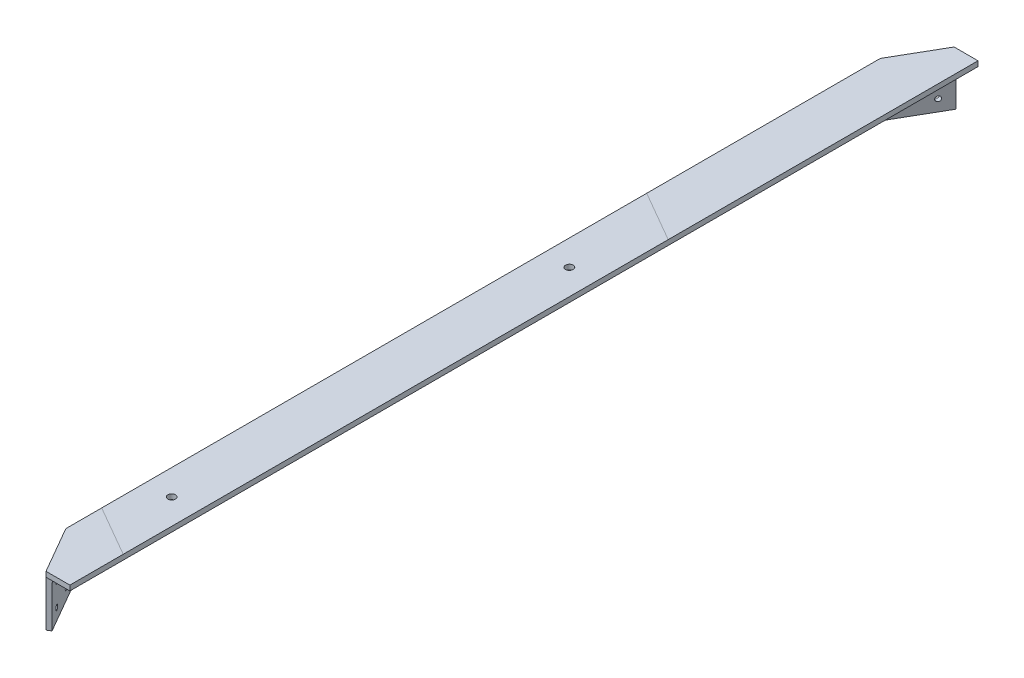
ISO-10303-21;
HEADER;
FILE_DESCRIPTION(('STEP AP214'),'2;1');
FILE_NAME('part.step','',(''),(''),'','','');
FILE_SCHEMA(('AUTOMOTIVE_DESIGN { 1 0 10303 214 1 1 1 1 }'));
ENDSEC;
DATA;
#1=APPLICATION_CONTEXT('core data for automotive mechanical design processes');
#2=APPLICATION_PROTOCOL_DEFINITION('international standard','automotive_design',2000,#1);
#3=PRODUCT_CONTEXT('',#1,'mechanical');
#4=PRODUCT('Part','Part','',(#3));
#5=PRODUCT_RELATED_PRODUCT_CATEGORY('part','',(#4));
#6=PRODUCT_DEFINITION_FORMATION('','',#4);
#7=PRODUCT_DEFINITION_CONTEXT('part definition',#1,'design');
#8=PRODUCT_DEFINITION('design','',#6,#7);
#9=PRODUCT_DEFINITION_SHAPE('','',#8);
#10=(LENGTH_UNIT() NAMED_UNIT(*) SI_UNIT(.MILLI.,.METRE.));
#11=(NAMED_UNIT(*) PLANE_ANGLE_UNIT() SI_UNIT($,.RADIAN.));
#12=(NAMED_UNIT(*) SI_UNIT($,.STERADIAN.) SOLID_ANGLE_UNIT());
#13=UNCERTAINTY_MEASURE_WITH_UNIT(LENGTH_MEASURE(1.E-05),#10,'distance_accuracy_value','');
#14=(GEOMETRIC_REPRESENTATION_CONTEXT(3) GLOBAL_UNCERTAINTY_ASSIGNED_CONTEXT((#13)) GLOBAL_UNIT_ASSIGNED_CONTEXT((#10,
#11,#12)) REPRESENTATION_CONTEXT('',''));
#15=CARTESIAN_POINT('',(0.,0.,0.));
#16=DIRECTION('',(0.,0.,1.));
#17=DIRECTION('',(1.,0.,0.));
#18=AXIS2_PLACEMENT_3D('',#15,#16,#17);
#19=CARTESIAN_POINT('',(-7.99999999999999,8.00000000000001,640.));
#20=DIRECTION('',(0.,-1.,0.));
#21=DIRECTION('',(1.,0.,0.));
#22=AXIS2_PLACEMENT_3D('',#19,#20,#21);
#23=PLANE('',#22);
#24=DIRECTION('',(-0.866025403784436,0.,-0.500000000000005));
#25=VECTOR('',#24,1.);
#26=CARTESIAN_POINT('',(387.319024505817,8.00000000000002,-44.7126356426317));
#27=LINE('',#26,#25);
#28=CARTESIAN_POINT('',(72.,8.00000000000001,-226.762159321677));
#29=VERTEX_POINT('',#28);
#30=CARTESIAN_POINT('',(-7.99999999999999,8.00000000000001,-272.950180856848));
#31=VERTEX_POINT('',#30);
#32=EDGE_CURVE('E11',#29,#31,#27,.T.);
#33=ORIENTED_EDGE('',*,*,#32,.F.);
#34=DIRECTION('',(0.,0.,-1.));
#35=VECTOR('',#34,1.);
#36=CARTESIAN_POINT('',(72.,8.00000000000001,640.));
#37=LINE('',#36,#35);
#38=CARTESIAN_POINT('',(72.,8.,-713.612159321677));
#39=VERTEX_POINT('',#38);
#40=EDGE_CURVE('E295',#29,#39,#37,.T.);
#41=ORIENTED_EDGE('',*,*,#40,.T.);
#42=DIRECTION('',(1.,0.,0.));
#43=VECTOR('',#42,1.);
#44=CARTESIAN_POINT('',(34.4999999999996,8.,-713.612159321677));
#45=LINE('',#44,#43);
#46=CARTESIAN_POINT('',(34.4999999999996,8.,-713.612159321677));
#47=VERTEX_POINT('',#46);
#48=EDGE_CURVE('E225',#47,#39,#45,.T.);
#49=ORIENTED_EDGE('',*,*,#48,.F.);
#50=DIRECTION('',(0.499999999999995,0.,-0.866025403784441));
#51=VECTOR('',#50,1.);
#52=CARTESIAN_POINT('',(-7.99999999999999,8.,-640.));
#53=LINE('',#52,#51);
#54=CARTESIAN_POINT('',(-6.66025403784448,8.,-642.320508075689));
#55=VERTEX_POINT('',#54);
#56=EDGE_CURVE('E228',#55,#47,#53,.T.);
#57=ORIENTED_EDGE('',*,*,#56,.F.);
#58=CARTESIAN_POINT('',(2.00000000000001,8.00000000000001,-637.320508075689));
#59=DIRECTION('',(0.,-1.,0.));
#60=DIRECTION('',(1.,0.,0.));
#61=AXIS2_PLACEMENT_3D('',#58,#59,#60);
#62=CIRCLE('',#61,10.);
#63=CARTESIAN_POINT('',(-7.99999999999999,8.00000000000001,-637.320508075689));
#64=VERTEX_POINT('',#63);
#65=EDGE_CURVE('E352',#55,#64,#62,.F.);
#66=ORIENTED_EDGE('',*,*,#65,.T.);
#67=DIRECTION('',(0.,0.,-1.));
#68=VECTOR('',#67,1.);
#69=CARTESIAN_POINT('',(-7.99999999999999,8.00000000000001,640.));
#70=LINE('',#69,#68);
#71=EDGE_CURVE('E291',#31,#64,#70,.T.);
#72=ORIENTED_EDGE('',*,*,#71,.F.);
#73=EDGE_LOOP('',(#33,#41,#49,#57,#66,#72));
#74=FACE_BOUND('',#73,.T.);
#75=ADVANCED_FACE('F49',(#74),#23,.F.);
#76=DIRECTION('',(0.866025403784436,0.,0.500000000000005));
#77=VECTOR('',#76,1.);
#78=CARTESIAN_POINT('',(16.4331150536629,8.00000000000001,597.68060333988));
#79=LINE('',#78,#77);
#80=CARTESIAN_POINT('',(-8.00000000000001,8.00000000000001,583.574137786507));
#81=VERTEX_POINT('',#80);
#82=CARTESIAN_POINT('',(72.,8.00000000000001,629.762159321678));
#83=VERTEX_POINT('',#82);
#84=EDGE_CURVE('E58',#81,#83,#79,.T.);
#85=ORIENTED_EDGE('',*,*,#84,.F.);
#86=CARTESIAN_POINT('',(-7.99999999999999,8.00000000000001,637.320508075689));
#87=VERTEX_POINT('',#86);
#88=EDGE_CURVE('E292',#87,#81,#70,.T.);
#89=ORIENTED_EDGE('',*,*,#88,.F.);
#90=CARTESIAN_POINT('',(2.00000000000001,8.00000000000001,637.320508075689));
#91=DIRECTION('',(0.,-1.,0.));
#92=DIRECTION('',(1.,0.,0.));
#93=AXIS2_PLACEMENT_3D('',#90,#91,#92);
#94=CIRCLE('',#93,10.);
#95=CARTESIAN_POINT('',(-6.66025403784442,8.,642.320508075689));
#96=VERTEX_POINT('',#95);
#97=EDGE_CURVE('E315',#87,#96,#94,.F.);
#98=ORIENTED_EDGE('',*,*,#97,.T.);
#99=DIRECTION('',(0.499999999999995,0.,0.866025403784441));
#100=VECTOR('',#99,1.);
#101=CARTESIAN_POINT('',(-7.99999999999999,8.,640.));
#102=LINE('',#101,#100);
#103=CARTESIAN_POINT('',(34.4999999999996,8.,713.612159321677));
#104=VERTEX_POINT('',#103);
#105=EDGE_CURVE('E278',#96,#104,#102,.T.);
#106=ORIENTED_EDGE('',*,*,#105,.T.);
#107=DIRECTION('',(1.,0.,0.));
#108=VECTOR('',#107,1.);
#109=CARTESIAN_POINT('',(34.4999999999996,8.,713.612159321677));
#110=LINE('',#109,#108);
#111=CARTESIAN_POINT('',(72.,8.,713.612159321677));
#112=VERTEX_POINT('',#111);
#113=EDGE_CURVE('E280',#104,#112,#110,.T.);
#114=ORIENTED_EDGE('',*,*,#113,.T.);
#115=EDGE_CURVE('E297',#112,#83,#37,.T.);
#116=ORIENTED_EDGE('',*,*,#115,.T.);
#117=EDGE_LOOP('',(#85,#89,#98,#106,#114,#116));
#118=FACE_BOUND('',#117,.T.);
#119=ADVANCED_FACE('F438',(#118),#23,.F.);
#120=CARTESIAN_POINT('',(72.,0.,640.));
#121=DIRECTION('',(0.,1.,0.));
#122=DIRECTION('',(-1.,0.,0.));
#123=AXIS2_PLACEMENT_3D('',#120,#121,#122);
#124=PLANE('',#123);
#125=CARTESIAN_POINT('',(32.,0.,-111.387840678322));
#126=DIRECTION('',(0.,1.,0.));
#127=DIRECTION('',(-1.,0.,0.));
#128=AXIS2_PLACEMENT_3D('',#125,#126,#127);
#129=CIRCLE('',#128,6.00000000000001);
#130=CARTESIAN_POINT('',(26.,0.,-111.387840678322));
#131=VERTEX_POINT('',#130);
#132=EDGE_CURVE('E382',#131,#131,#129,.T.);
#133=ORIENTED_EDGE('',*,*,#132,.T.);
#134=EDGE_LOOP('',(#133));
#135=FACE_BOUND('',#134,.T.);
#136=CARTESIAN_POINT('',(32.,0.,513.612159321678));
#137=DIRECTION('',(0.,1.,0.));
#138=DIRECTION('',(-1.,0.,0.));
#139=AXIS2_PLACEMENT_3D('',#136,#137,#138);
#140=CIRCLE('',#139,6.00000000000001);
#141=CARTESIAN_POINT('',(26.,0.,513.612159321678));
#142=VERTEX_POINT('',#141);
#143=EDGE_CURVE('E604',#142,#142,#140,.T.);
#144=ORIENTED_EDGE('',*,*,#143,.T.);
#145=EDGE_LOOP('',(#144));
#146=FACE_BOUND('',#145,.T.);
#147=DIRECTION('',(0.,0.,-1.));
#148=VECTOR('',#147,1.);
#149=CARTESIAN_POINT('',(8.00000000000001,0.,0.));
#150=LINE('',#149,#148);
#151=CARTESIAN_POINT('',(8.,0.,637.320508075689));
#152=VERTEX_POINT('',#151);
#153=CARTESIAN_POINT('',(8.00000000000001,0.,0.));
#154=VERTEX_POINT('',#153);
#155=EDGE_CURVE('E328',#152,#154,#150,.T.);
#156=ORIENTED_EDGE('',*,*,#155,.T.);
#157=DIRECTION('',(0.,0.,1.));
#158=VECTOR('',#157,1.);
#159=CARTESIAN_POINT('',(8.,0.,-637.320508075689));
#160=LINE('',#159,#158);
#161=CARTESIAN_POINT('',(8.,0.,-637.320508075689));
#162=VERTEX_POINT('',#161);
#163=EDGE_CURVE('E370',#154,#162,#160,.F.);
#164=ORIENTED_EDGE('',*,*,#163,.T.);
#165=CARTESIAN_POINT('',(10.,0.,-637.320508075689));
#166=DIRECTION('',(0.,1.,0.));
#167=DIRECTION('',(-1.,0.,0.));
#168=AXIS2_PLACEMENT_3D('',#165,#166,#167);
#169=CIRCLE('',#168,2.);
#170=CARTESIAN_POINT('',(8.26794919243096,0.,-638.320508075689));
#171=VERTEX_POINT('',#170);
#172=EDGE_CURVE('E368',#162,#171,#169,.F.);
#173=ORIENTED_EDGE('',*,*,#172,.T.);
#174=DIRECTION('',(0.499999999999996,0.,-0.866025403784441));
#175=VECTOR('',#174,1.);
#176=CARTESIAN_POINT('',(-529.328055191762,0.,292.823085463766));
#177=LINE('',#176,#175);
#178=CARTESIAN_POINT('',(47.4282032302751,0.,-706.14805770654));
#179=VERTEX_POINT('',#178);
#180=EDGE_CURVE('E365',#171,#179,#177,.T.);
#181=ORIENTED_EDGE('',*,*,#180,.T.);
#182=DIRECTION('',(-0.866025403784439,0.,-0.5));
#183=VECTOR('',#182,1.);
#184=CARTESIAN_POINT('',(34.4999999999996,0.,-713.612159321677));
#185=LINE('',#184,#183);
#186=CARTESIAN_POINT('',(34.4999999999996,0.,-713.612159321677));
#187=VERTEX_POINT('',#186);
#188=EDGE_CURVE('E212',#179,#187,#185,.T.);
#189=ORIENTED_EDGE('',*,*,#188,.T.);
#190=DIRECTION('',(1.,0.,0.));
#191=VECTOR('',#190,1.);
#192=CARTESIAN_POINT('',(34.4999999999996,0.,-713.612159321677));
#193=LINE('',#192,#191);
#194=CARTESIAN_POINT('',(72.,0.,-713.612159321677));
#195=VERTEX_POINT('',#194);
#196=EDGE_CURVE('E202',#187,#195,#193,.T.);
#197=ORIENTED_EDGE('',*,*,#196,.T.);
#198=DIRECTION('',(0.,0.,-1.));
#199=VECTOR('',#198,1.);
#200=CARTESIAN_POINT('',(72.,0.,640.));
#201=LINE('',#200,#199);
#202=CARTESIAN_POINT('',(72.,0.,713.612159321677));
#203=VERTEX_POINT('',#202);
#204=EDGE_CURVE('E300',#203,#195,#201,.T.);
#205=ORIENTED_EDGE('',*,*,#204,.F.);
#206=DIRECTION('',(1.,0.,0.));
#207=VECTOR('',#206,1.);
#208=CARTESIAN_POINT('',(34.4999999999996,0.,713.612159321677));
#209=LINE('',#208,#207);
#210=CARTESIAN_POINT('',(34.4999999999996,0.,713.612159321677));
#211=VERTEX_POINT('',#210);
#212=EDGE_CURVE('E277',#211,#203,#209,.T.);
#213=ORIENTED_EDGE('',*,*,#212,.F.);
#214=DIRECTION('',(-0.866025403784439,0.,0.5));
#215=VECTOR('',#214,1.);
#216=CARTESIAN_POINT('',(34.4999999999996,0.,713.612159321677));
#217=LINE('',#216,#215);
#218=CARTESIAN_POINT('',(47.4282032302752,0.,706.14805770654));
#219=VERTEX_POINT('',#218);
#220=EDGE_CURVE('E262',#219,#211,#217,.T.);
#221=ORIENTED_EDGE('',*,*,#220,.F.);
#222=DIRECTION('',(0.499999999999996,0.,0.866025403784441));
#223=VECTOR('',#222,1.);
#224=CARTESIAN_POINT('',(8.26794919243111,0.,638.320508075689));
#225=LINE('',#224,#223);
#226=CARTESIAN_POINT('',(8.26794919243111,0.,638.320508075689));
#227=VERTEX_POINT('',#226);
#228=EDGE_CURVE('E324',#219,#227,#225,.F.);
#229=ORIENTED_EDGE('',*,*,#228,.T.);
#230=CARTESIAN_POINT('',(10.,0.,637.320508075689));
#231=DIRECTION('',(0.,1.,0.));
#232=DIRECTION('',(-1.,0.,0.));
#233=AXIS2_PLACEMENT_3D('',#230,#231,#232);
#234=CIRCLE('',#233,2.);
#235=EDGE_CURVE('E326',#227,#152,#234,.F.);
#236=ORIENTED_EDGE('',*,*,#235,.T.);
#237=EDGE_LOOP('',(#156,#164,#173,#181,#189,#197,#205,#213,#221,#229,#236));
#238=FACE_BOUND('',#237,.T.);
#239=ADVANCED_FACE('F445',(#135,#146,#238),#124,.F.);
#240=CARTESIAN_POINT('',(-8.,-72.,640.));
#241=DIRECTION('',(1.,0.,0.));
#242=DIRECTION('',(0.,1.,0.));
#243=AXIS2_PLACEMENT_3D('',#240,#241,#242);
#244=PLANE('',#243);
#245=ORIENTED_EDGE('',*,*,#88,.T.);
#246=EDGE_CURVE('E296',#81,#31,#70,.T.);
#247=ORIENTED_EDGE('',*,*,#246,.T.);
#248=ORIENTED_EDGE('',*,*,#71,.T.);
#249=DIRECTION('',(0.,-1.,0.));
#250=VECTOR('',#249,1.);
#251=CARTESIAN_POINT('',(-8.,-72.,-637.320508075689));
#252=LINE('',#251,#250);
#253=CARTESIAN_POINT('',(-8.,-72.,-637.320508075689));
#254=VERTEX_POINT('',#253);
#255=EDGE_CURVE('E342',#64,#254,#252,.T.);
#256=ORIENTED_EDGE('',*,*,#255,.T.);
#257=DIRECTION('',(0.,0.,-1.));
#258=VECTOR('',#257,1.);
#259=CARTESIAN_POINT('',(-8.,-72.,640.));
#260=LINE('',#259,#258);
#261=CARTESIAN_POINT('',(-8.,-72.,637.320508075689));
#262=VERTEX_POINT('',#261);
#263=EDGE_CURVE('E306',#262,#254,#260,.T.);
#264=ORIENTED_EDGE('',*,*,#263,.F.);
#265=DIRECTION('',(0.,-1.,0.));
#266=VECTOR('',#265,1.);
#267=CARTESIAN_POINT('',(-8.,-72.,637.320508075689));
#268=LINE('',#267,#266);
#269=EDGE_CURVE('E313',#262,#87,#268,.F.);
#270=ORIENTED_EDGE('',*,*,#269,.T.);
#271=EDGE_LOOP('',(#245,#247,#248,#256,#264,#270));
#272=FACE_BOUND('',#271,.T.);
#273=ADVANCED_FACE('F531',(#272),#244,.F.);
#274=CARTESIAN_POINT('',(0.,-72.,640.));
#275=DIRECTION('',(0.,1.,0.));
#276=DIRECTION('',(0.,0.,1.));
#277=AXIS2_PLACEMENT_3D('',#274,#275,#276);
#278=PLANE('',#277);
#279=ORIENTED_EDGE('',*,*,#263,.T.);
#280=CARTESIAN_POINT('',(2.,-72.,-637.320508075689));
#281=DIRECTION('',(0.,1.,0.));
#282=DIRECTION('',(0.,0.,1.));
#283=AXIS2_PLACEMENT_3D('',#280,#281,#282);
#284=CIRCLE('',#283,10.);
#285=CARTESIAN_POINT('',(-6.66025403784449,-72.,-642.320508075689));
#286=VERTEX_POINT('',#285);
#287=EDGE_CURVE('E211',#254,#286,#284,.F.);
#288=ORIENTED_EDGE('',*,*,#287,.T.);
#289=DIRECTION('',(-0.499999999999996,0.,0.866025403784441));
#290=VECTOR('',#289,1.);
#291=CARTESIAN_POINT('',(-8.,-72.,-640.));
#292=LINE('',#291,#290);
#293=CARTESIAN_POINT('',(34.4999999999996,-72.,-713.612159321677));
#294=VERTEX_POINT('',#293);
#295=EDGE_CURVE('E195',#294,#286,#292,.T.);
#296=ORIENTED_EDGE('',*,*,#295,.F.);
#297=DIRECTION('',(-0.866025403784439,0.,-0.5));
#298=VECTOR('',#297,1.);
#299=CARTESIAN_POINT('',(34.4999999999996,-72.,-713.612159321677));
#300=LINE('',#299,#298);
#301=CARTESIAN_POINT('',(40.4999999999997,-72.,-710.14805770654));
#302=VERTEX_POINT('',#301);
#303=EDGE_CURVE('E210',#302,#294,#300,.T.);
#304=ORIENTED_EDGE('',*,*,#303,.F.);
#305=DIRECTION('',(0.499999999999996,0.,-0.866025403784441));
#306=VECTOR('',#305,1.);
#307=CARTESIAN_POINT('',(40.4999999999997,-72.,-710.14805770654));
#308=LINE('',#307,#306);
#309=CARTESIAN_POINT('',(1.33974596215551,-72.,-642.320508075689));
#310=VERTEX_POINT('',#309);
#311=EDGE_CURVE('E217',#310,#302,#308,.T.);
#312=ORIENTED_EDGE('',*,*,#311,.F.);
#313=CARTESIAN_POINT('',(10.,-72.,-637.320508075689));
#314=DIRECTION('',(0.,1.,0.));
#315=DIRECTION('',(0.,0.,1.));
#316=AXIS2_PLACEMENT_3D('',#313,#314,#315);
#317=CIRCLE('',#316,10.);
#318=CARTESIAN_POINT('',(0.,-72.,-637.320508075689));
#319=VERTEX_POINT('',#318);
#320=EDGE_CURVE('E360',#310,#319,#317,.T.);
#321=ORIENTED_EDGE('',*,*,#320,.T.);
#322=DIRECTION('',(0.,0.,-1.));
#323=VECTOR('',#322,1.);
#324=CARTESIAN_POINT('',(0.,-72.,640.));
#325=LINE('',#324,#323);
#326=CARTESIAN_POINT('',(0.,-72.,637.320508075689));
#327=VERTEX_POINT('',#326);
#328=EDGE_CURVE('E303',#327,#319,#325,.T.);
#329=ORIENTED_EDGE('',*,*,#328,.F.);
#330=CARTESIAN_POINT('',(10.,-72.,637.320508075689));
#331=DIRECTION('',(0.,1.,0.));
#332=DIRECTION('',(0.,0.,1.));
#333=AXIS2_PLACEMENT_3D('',#330,#331,#332);
#334=CIRCLE('',#333,10.);
#335=CARTESIAN_POINT('',(1.33974596215557,-72.,642.320508075689));
#336=VERTEX_POINT('',#335);
#337=EDGE_CURVE('E322',#327,#336,#334,.T.);
#338=ORIENTED_EDGE('',*,*,#337,.T.);
#339=DIRECTION('',(0.499999999999996,0.,0.866025403784441));
#340=VECTOR('',#339,1.);
#341=CARTESIAN_POINT('',(40.4999999999997,-72.,710.14805770654));
#342=LINE('',#341,#340);
#343=CARTESIAN_POINT('',(40.4999999999997,-72.,710.14805770654));
#344=VERTEX_POINT('',#343);
#345=EDGE_CURVE('E263',#336,#344,#342,.T.);
#346=ORIENTED_EDGE('',*,*,#345,.T.);
#347=DIRECTION('',(-0.866025403784439,0.,0.5));
#348=VECTOR('',#347,1.);
#349=CARTESIAN_POINT('',(34.4999999999996,-72.,713.612159321677));
#350=LINE('',#349,#348);
#351=CARTESIAN_POINT('',(34.4999999999996,-72.,713.612159321677));
#352=VERTEX_POINT('',#351);
#353=EDGE_CURVE('E265',#344,#352,#350,.T.);
#354=ORIENTED_EDGE('',*,*,#353,.T.);
#355=DIRECTION('',(-0.499999999999996,0.,-0.866025403784441));
#356=VECTOR('',#355,1.);
#357=CARTESIAN_POINT('',(-8.,-72.,640.));
#358=LINE('',#357,#356);
#359=CARTESIAN_POINT('',(-6.66025403784442,-72.,642.320508075689));
#360=VERTEX_POINT('',#359);
#361=EDGE_CURVE('E267',#352,#360,#358,.T.);
#362=ORIENTED_EDGE('',*,*,#361,.T.);
#363=CARTESIAN_POINT('',(2.,-72.,637.320508075689));
#364=DIRECTION('',(0.,1.,0.));
#365=DIRECTION('',(0.,0.,1.));
#366=AXIS2_PLACEMENT_3D('',#363,#364,#365);
#367=CIRCLE('',#366,10.);
#368=EDGE_CURVE('E311',#360,#262,#367,.F.);
#369=ORIENTED_EDGE('',*,*,#368,.T.);
#370=EDGE_LOOP('',(#279,#288,#296,#304,#312,#321,#329,#338,#346,#354,#362,#369));
#371=FACE_BOUND('',#370,.T.);
#372=ADVANCED_FACE('F208',(#371),#278,.F.);
#373=CARTESIAN_POINT('',(0.,0.,640.));
#374=DIRECTION('',(-1.,0.,0.));
#375=DIRECTION('',(0.,-1.,0.));
#376=AXIS2_PLACEMENT_3D('',#373,#374,#375);
#377=PLANE('',#376);
#378=DIRECTION('',(0.,1.,0.));
#379=VECTOR('',#378,1.);
#380=CARTESIAN_POINT('',(0.,0.,-637.320508075689));
#381=LINE('',#380,#379);
#382=CARTESIAN_POINT('',(0.,-8.,-637.320508075689));
#383=VERTEX_POINT('',#382);
#384=EDGE_CURVE('E355',#319,#383,#381,.T.);
#385=ORIENTED_EDGE('',*,*,#384,.T.);
#386=DIRECTION('',(0.,0.,1.));
#387=VECTOR('',#386,1.);
#388=CARTESIAN_POINT('',(0.,-8.,0.));
#389=LINE('',#388,#387);
#390=CARTESIAN_POINT('',(0.,-8.,0.));
#391=VERTEX_POINT('',#390);
#392=EDGE_CURVE('E362',#383,#391,#389,.T.);
#393=ORIENTED_EDGE('',*,*,#392,.T.);
#394=DIRECTION('',(0.,0.,-1.));
#395=VECTOR('',#394,1.);
#396=CARTESIAN_POINT('',(0.,-8.,637.320508075689));
#397=LINE('',#396,#395);
#398=CARTESIAN_POINT('',(0.,-8.00000000000001,637.320508075689));
#399=VERTEX_POINT('',#398);
#400=EDGE_CURVE('E331',#391,#399,#397,.F.);
#401=ORIENTED_EDGE('',*,*,#400,.T.);
#402=DIRECTION('',(0.,1.,0.));
#403=VECTOR('',#402,1.);
#404=CARTESIAN_POINT('',(0.,-72.,637.320508075689));
#405=LINE('',#404,#403);
#406=EDGE_CURVE('E320',#399,#327,#405,.F.);
#407=ORIENTED_EDGE('',*,*,#406,.T.);
#408=ORIENTED_EDGE('',*,*,#328,.T.);
#409=EDGE_LOOP('',(#385,#393,#401,#407,#408));
#410=FACE_BOUND('',#409,.T.);
#411=ADVANCED_FACE('F461',(#410),#377,.F.);
#412=CARTESIAN_POINT('',(72.,8.00000000000001,640.));
#413=DIRECTION('',(-1.,0.,0.));
#414=DIRECTION('',(0.,0.,1.));
#415=AXIS2_PLACEMENT_3D('',#412,#413,#414);
#416=PLANE('',#415);
#417=ORIENTED_EDGE('',*,*,#204,.T.);
#418=DIRECTION('',(0.,-1.,0.));
#419=VECTOR('',#418,1.);
#420=CARTESIAN_POINT('',(72.,8.,-713.612159321677));
#421=LINE('',#420,#419);
#422=EDGE_CURVE('E233',#39,#195,#421,.T.);
#423=ORIENTED_EDGE('',*,*,#422,.F.);
#424=ORIENTED_EDGE('',*,*,#40,.F.);
#425=EDGE_CURVE('E301',#83,#29,#37,.T.);
#426=ORIENTED_EDGE('',*,*,#425,.F.);
#427=ORIENTED_EDGE('',*,*,#115,.F.);
#428=DIRECTION('',(0.,-1.,0.));
#429=VECTOR('',#428,1.);
#430=CARTESIAN_POINT('',(72.,8.,713.612159321677));
#431=LINE('',#430,#429);
#432=EDGE_CURVE('E283',#112,#203,#431,.T.);
#433=ORIENTED_EDGE('',*,*,#432,.T.);
#434=EDGE_LOOP('',(#417,#423,#424,#426,#427,#433));
#435=FACE_BOUND('',#434,.T.);
#436=ADVANCED_FACE('F451',(#435),#416,.F.);
#437=CARTESIAN_POINT('',(32.,8.00000000000001,-111.387840678322));
#438=DIRECTION('',(0.,1.,0.));
#439=DIRECTION('',(-1.,0.,0.));
#440=AXIS2_PLACEMENT_3D('',#437,#438,#439);
#441=CIRCLE('',#440,6.00000000000001);
#442=CARTESIAN_POINT('',(26.,8.00000000000001,-111.387840678322));
#443=VERTEX_POINT('',#442);
#444=EDGE_CURVE('E466',#443,#443,#441,.T.);
#445=ORIENTED_EDGE('',*,*,#444,.F.);
#446=EDGE_LOOP('',(#445));
#447=FACE_BOUND('',#446,.T.);
#448=CARTESIAN_POINT('',(32.,8.00000000000001,513.612159321678));
#449=DIRECTION('',(0.,1.,0.));
#450=DIRECTION('',(-1.,0.,0.));
#451=AXIS2_PLACEMENT_3D('',#448,#449,#450);
#452=CIRCLE('',#451,6.00000000000001);
#453=CARTESIAN_POINT('',(26.,8.00000000000001,513.612159321678));
#454=VERTEX_POINT('',#453);
#455=EDGE_CURVE('E469',#454,#454,#452,.T.);
#456=ORIENTED_EDGE('',*,*,#455,.F.);
#457=EDGE_LOOP('',(#456));
#458=FACE_BOUND('',#457,.T.);
#459=ORIENTED_EDGE('',*,*,#425,.T.);
#460=ORIENTED_EDGE('',*,*,#32,.T.);
#461=ORIENTED_EDGE('',*,*,#246,.F.);
#462=ORIENTED_EDGE('',*,*,#84,.T.);
#463=EDGE_LOOP('',(#459,#460,#461,#462));
#464=FACE_BOUND('',#463,.T.);
#465=ADVANCED_FACE('F440',(#447,#458,#464),#23,.F.);
#466=CARTESIAN_POINT('',(-7.99999999999999,8.,640.));
#467=DIRECTION('',(0.866025403784441,0.,-0.499999999999995));
#468=DIRECTION('',(-0.499999999999995,0.,-0.866025403784441));
#469=AXIS2_PLACEMENT_3D('',#466,#467,#468);
#470=PLANE('',#469);
#471=CARTESIAN_POINT('',(24.3749999999998,-54.,696.075144895043));
#472=DIRECTION('',(0.866025403784441,0.,-0.499999999999995));
#473=DIRECTION('',(-0.499999999999995,0.,-0.866025403784441));
#474=AXIS2_PLACEMENT_3D('',#471,#472,#473);
#475=CIRCLE('',#474,4.00000000000006);
#476=CARTESIAN_POINT('',(22.3749999999998,-54.,692.611043279905));
#477=VERTEX_POINT('',#476);
#478=EDGE_CURVE('E259',#477,#477,#475,.T.);
#479=ORIENTED_EDGE('',*,*,#478,.T.);
#480=EDGE_LOOP('',(#479));
#481=FACE_BOUND('',#480,.T.);
#482=CARTESIAN_POINT('',(4.12499999999999,-54.,661.001116041773));
#483=DIRECTION('',(0.866025403784441,0.,-0.499999999999995));
#484=DIRECTION('',(-0.499999999999995,0.,-0.866025403784441));
#485=AXIS2_PLACEMENT_3D('',#482,#483,#484);
#486=CIRCLE('',#485,3.99999999999997);
#487=CARTESIAN_POINT('',(2.12500000000002,-54.,657.537014426635));
#488=VERTEX_POINT('',#487);
#489=EDGE_CURVE('E256',#488,#488,#486,.T.);
#490=ORIENTED_EDGE('',*,*,#489,.T.);
#491=EDGE_LOOP('',(#490));
#492=FACE_BOUND('',#491,.T.);
#493=CARTESIAN_POINT('',(4.12499999999999,-18.,661.001116041773));
#494=DIRECTION('',(0.866025403784441,0.,-0.499999999999995));
#495=DIRECTION('',(-0.499999999999995,0.,-0.866025403784441));
#496=AXIS2_PLACEMENT_3D('',#493,#494,#495);
#497=CIRCLE('',#496,3.99999999999997);
#498=CARTESIAN_POINT('',(2.12500000000002,-18.,657.537014426635));
#499=VERTEX_POINT('',#498);
#500=EDGE_CURVE('E253',#499,#499,#497,.T.);
#501=ORIENTED_EDGE('',*,*,#500,.T.);
#502=EDGE_LOOP('',(#501));
#503=FACE_BOUND('',#502,.T.);
#504=CARTESIAN_POINT('',(24.3749999999998,-18.,696.075144895043));
#505=DIRECTION('',(0.866025403784441,0.,-0.499999999999995));
#506=DIRECTION('',(-0.499999999999995,0.,-0.866025403784441));
#507=AXIS2_PLACEMENT_3D('',#504,#505,#506);
#508=CIRCLE('',#507,4.00000000000006);
#509=CARTESIAN_POINT('',(22.3749999999998,-18.,692.611043279905));
#510=VERTEX_POINT('',#509);
#511=EDGE_CURVE('E250',#510,#510,#508,.T.);
#512=ORIENTED_EDGE('',*,*,#511,.T.);
#513=EDGE_LOOP('',(#512));
#514=FACE_BOUND('',#513,.T.);
#515=ORIENTED_EDGE('',*,*,#105,.F.);
#516=DIRECTION('',(0.,-1.,0.));
#517=VECTOR('',#516,1.);
#518=CARTESIAN_POINT('',(-6.66025403784442,8.,642.320508075689));
#519=LINE('',#518,#517);
#520=EDGE_CURVE('E308',#96,#360,#519,.T.);
#521=ORIENTED_EDGE('',*,*,#520,.T.);
#522=ORIENTED_EDGE('',*,*,#361,.F.);
#523=DIRECTION('',(0.,1.,0.));
#524=VECTOR('',#523,1.);
#525=CARTESIAN_POINT('',(34.4999999999996,-72.,713.612159321677));
#526=LINE('',#525,#524);
#527=EDGE_CURVE('E270',#352,#211,#526,.T.);
#528=ORIENTED_EDGE('',*,*,#527,.T.);
#529=DIRECTION('',(0.,-1.,0.));
#530=VECTOR('',#529,1.);
#531=CARTESIAN_POINT('',(34.4999999999996,8.,713.612159321677));
#532=LINE('',#531,#530);
#533=EDGE_CURVE('E288',#104,#211,#532,.T.);
#534=ORIENTED_EDGE('',*,*,#533,.F.);
#535=EDGE_LOOP('',(#515,#521,#522,#528,#534));
#536=FACE_BOUND('',#535,.T.);
#537=ADVANCED_FACE('F450',(#481,#492,#503,#514,#536),#470,.F.);
#538=CARTESIAN_POINT('',(34.4999999999996,8.,713.612159321677));
#539=DIRECTION('',(0.,0.,-1.));
#540=DIRECTION('',(-1.,0.,0.));
#541=AXIS2_PLACEMENT_3D('',#538,#539,#540);
#542=PLANE('',#541);
#543=ORIENTED_EDGE('',*,*,#212,.T.);
#544=ORIENTED_EDGE('',*,*,#432,.F.);
#545=ORIENTED_EDGE('',*,*,#113,.F.);
#546=ORIENTED_EDGE('',*,*,#533,.T.);
#547=EDGE_LOOP('',(#543,#544,#545,#546));
#548=FACE_BOUND('',#547,.T.);
#549=ADVANCED_FACE('F458',(#548),#542,.F.);
#550=CARTESIAN_POINT('',(40.4999999999997,-72.,710.14805770654));
#551=DIRECTION('',(-0.866025403784441,0.,0.499999999999996));
#552=DIRECTION('',(0.499999999999996,0.,0.866025403784441));
#553=AXIS2_PLACEMENT_3D('',#550,#551,#552);
#554=PLANE('',#553);
#555=CARTESIAN_POINT('',(30.3749999999997,-54.,692.611043279905));
#556=DIRECTION('',(0.866025403784441,0.,-0.499999999999996));
#557=DIRECTION('',(0.499999999999996,0.,0.866025403784441));
#558=AXIS2_PLACEMENT_3D('',#555,#556,#557);
#559=CIRCLE('',#558,4.00000000000006);
#560=CARTESIAN_POINT('',(32.3749999999997,-54.,696.075144895043));
#561=VERTEX_POINT('',#560);
#562=EDGE_CURVE('E244',#561,#561,#559,.T.);
#563=ORIENTED_EDGE('',*,*,#562,.F.);
#564=EDGE_LOOP('',(#563));
#565=FACE_BOUND('',#564,.T.);
#566=CARTESIAN_POINT('',(10.1249999999999,-54.,657.537014426635));
#567=DIRECTION('',(0.866025403784441,0.,-0.499999999999996));
#568=DIRECTION('',(-0.499999999999996,0.,-0.866025403784441));
#569=AXIS2_PLACEMENT_3D('',#566,#567,#568);
#570=CIRCLE('',#569,3.99999999999997);
#571=CARTESIAN_POINT('',(8.12499999999997,-54.,654.072912811497));
#572=VERTEX_POINT('',#571);
#573=EDGE_CURVE('E241',#572,#572,#570,.T.);
#574=ORIENTED_EDGE('',*,*,#573,.F.);
#575=EDGE_LOOP('',(#574));
#576=FACE_BOUND('',#575,.T.);
#577=CARTESIAN_POINT('',(10.1249999999999,-18.,657.537014426635));
#578=DIRECTION('',(0.866025403784441,0.,-0.499999999999996));
#579=DIRECTION('',(0.499999999999996,0.,0.866025403784441));
#580=AXIS2_PLACEMENT_3D('',#577,#578,#579);
#581=CIRCLE('',#580,3.99999999999997);
#582=CARTESIAN_POINT('',(12.1249999999999,-18.,661.001116041773));
#583=VERTEX_POINT('',#582);
#584=EDGE_CURVE('E237',#583,#583,#581,.T.);
#585=ORIENTED_EDGE('',*,*,#584,.F.);
#586=EDGE_LOOP('',(#585));
#587=FACE_BOUND('',#586,.T.);
#588=CARTESIAN_POINT('',(30.3749999999997,-18.,692.611043279905));
#589=DIRECTION('',(0.866025403784441,0.,-0.499999999999996));
#590=DIRECTION('',(-0.499999999999996,0.,-0.866025403784441));
#591=AXIS2_PLACEMENT_3D('',#588,#589,#590);
#592=CIRCLE('',#591,4.00000000000006);
#593=CARTESIAN_POINT('',(28.3749999999997,-18.,689.146941664767));
#594=VERTEX_POINT('',#593);
#595=EDGE_CURVE('E240',#594,#594,#592,.T.);
#596=ORIENTED_EDGE('',*,*,#595,.F.);
#597=EDGE_LOOP('',(#596));
#598=FACE_BOUND('',#597,.T.);
#599=DIRECTION('',(0.,1.,0.));
#600=VECTOR('',#599,1.);
#601=CARTESIAN_POINT('',(1.33974596215556,0.,642.320508075689));
#602=LINE('',#601,#600);
#603=CARTESIAN_POINT('',(1.33974596215556,-8.,642.320508075689));
#604=VERTEX_POINT('',#603);
#605=EDGE_CURVE('E317',#336,#604,#602,.T.);
#606=ORIENTED_EDGE('',*,*,#605,.T.);
#607=DIRECTION('',(0.499999999999996,0.,0.866025403784441));
#608=VECTOR('',#607,1.);
#609=CARTESIAN_POINT('',(40.4999999999996,-7.99999999999999,710.14805770654));
#610=LINE('',#609,#608);
#611=CARTESIAN_POINT('',(40.4999999999997,-7.99999999999999,710.14805770654));
#612=VERTEX_POINT('',#611);
#613=EDGE_CURVE('E335',#604,#612,#610,.T.);
#614=ORIENTED_EDGE('',*,*,#613,.T.);
#615=DIRECTION('',(0.,1.,0.));
#616=VECTOR('',#615,1.);
#617=CARTESIAN_POINT('',(40.4999999999997,-72.,710.14805770654));
#618=LINE('',#617,#616);
#619=EDGE_CURVE('E274',#344,#612,#618,.T.);
#620=ORIENTED_EDGE('',*,*,#619,.F.);
#621=ORIENTED_EDGE('',*,*,#345,.F.);
#622=EDGE_LOOP('',(#606,#614,#620,#621));
#623=FACE_BOUND('',#622,.T.);
#624=ADVANCED_FACE('F502',(#565,#576,#587,#598,#623),#554,.F.);
#625=CARTESIAN_POINT('',(34.4999999999996,-72.,713.612159321677));
#626=DIRECTION('',(-0.5,0.,-0.866025403784439));
#627=DIRECTION('',(-0.866025403784439,0.,0.5));
#628=AXIS2_PLACEMENT_3D('',#625,#626,#627);
#629=PLANE('',#628);
#630=ORIENTED_EDGE('',*,*,#220,.T.);
#631=ORIENTED_EDGE('',*,*,#527,.F.);
#632=ORIENTED_EDGE('',*,*,#353,.F.);
#633=ORIENTED_EDGE('',*,*,#619,.T.);
#634=CARTESIAN_POINT('',(47.4282032302752,-7.99999999999999,706.14805770654));
#635=DIRECTION('',(-0.5,0.,-0.866025403784439));
#636=DIRECTION('',(-0.866025403784439,0.,0.5));
#637=AXIS2_PLACEMENT_3D('',#634,#635,#636);
#638=CIRCLE('',#637,8.);
#639=EDGE_CURVE('E339',#612,#219,#638,.T.);
#640=ORIENTED_EDGE('',*,*,#639,.T.);
#641=EDGE_LOOP('',(#630,#631,#632,#633,#640));
#642=FACE_BOUND('',#641,.T.);
#643=ADVANCED_FACE('F517',(#642),#629,.F.);
#644=CARTESIAN_POINT('',(23.4467967697242,-18.,696.611043279905));
#645=DIRECTION('',(0.866025403784441,0.,-0.499999999999996));
#646=DIRECTION('',(-0.499999999999996,0.,-0.866025403784441));
#647=AXIS2_PLACEMENT_3D('',#644,#645,#646);
#648=CYLINDRICAL_SURFACE('',#647,4.00000000000006);
#649=ORIENTED_EDGE('',*,*,#595,.T.);
#650=EDGE_LOOP('',(#649));
#651=FACE_BOUND('',#650,.T.);
#652=ORIENTED_EDGE('',*,*,#511,.F.);
#653=EDGE_LOOP('',(#652));
#654=FACE_BOUND('',#653,.T.);
#655=ADVANCED_FACE('F549',(#651,#654),#648,.F.);
#656=CARTESIAN_POINT('',(3.19679676972441,-18.,661.537014426635));
#657=DIRECTION('',(0.866025403784441,0.,-0.499999999999996));
#658=DIRECTION('',(-0.499999999999996,0.,-0.866025403784441));
#659=AXIS2_PLACEMENT_3D('',#656,#657,#658);
#660=CYLINDRICAL_SURFACE('',#659,3.99999999999997);
#661=ORIENTED_EDGE('',*,*,#584,.T.);
#662=EDGE_LOOP('',(#661));
#663=FACE_BOUND('',#662,.T.);
#664=ORIENTED_EDGE('',*,*,#500,.F.);
#665=EDGE_LOOP('',(#664));
#666=FACE_BOUND('',#665,.T.);
#667=ADVANCED_FACE('F551',(#663,#666),#660,.F.);
#668=CARTESIAN_POINT('',(3.19679676972441,-54.,661.537014426635));
#669=DIRECTION('',(0.866025403784441,0.,-0.499999999999996));
#670=DIRECTION('',(-0.499999999999996,0.,-0.866025403784441));
#671=AXIS2_PLACEMENT_3D('',#668,#669,#670);
#672=CYLINDRICAL_SURFACE('',#671,3.99999999999997);
#673=ORIENTED_EDGE('',*,*,#573,.T.);
#674=EDGE_LOOP('',(#673));
#675=FACE_BOUND('',#674,.T.);
#676=ORIENTED_EDGE('',*,*,#489,.F.);
#677=EDGE_LOOP('',(#676));
#678=FACE_BOUND('',#677,.T.);
#679=ADVANCED_FACE('F556',(#675,#678),#672,.F.);
#680=CARTESIAN_POINT('',(23.4467967697242,-54.,696.611043279905));
#681=DIRECTION('',(0.866025403784441,0.,-0.499999999999996));
#682=DIRECTION('',(-0.499999999999996,0.,-0.866025403784441));
#683=AXIS2_PLACEMENT_3D('',#680,#681,#682);
#684=CYLINDRICAL_SURFACE('',#683,4.00000000000006);
#685=ORIENTED_EDGE('',*,*,#562,.T.);
#686=EDGE_LOOP('',(#685));
#687=FACE_BOUND('',#686,.T.);
#688=ORIENTED_EDGE('',*,*,#478,.F.);
#689=EDGE_LOOP('',(#688));
#690=FACE_BOUND('',#689,.T.);
#691=ADVANCED_FACE('F553',(#687,#690),#684,.F.);
#692=CARTESIAN_POINT('',(2.00000000000001,8.,637.320508075689));
#693=DIRECTION('',(0.,-1.,0.));
#694=DIRECTION('',(0.,0.,-1.));
#695=AXIS2_PLACEMENT_3D('',#692,#693,#694);
#696=CYLINDRICAL_SURFACE('',#695,10.);
#697=ORIENTED_EDGE('',*,*,#97,.F.);
#698=ORIENTED_EDGE('',*,*,#269,.F.);
#699=ORIENTED_EDGE('',*,*,#368,.F.);
#700=ORIENTED_EDGE('',*,*,#520,.F.);
#701=EDGE_LOOP('',(#697,#698,#699,#700));
#702=FACE_BOUND('',#701,.T.);
#703=ADVANCED_FACE('F527',(#702),#696,.T.);
#704=CARTESIAN_POINT('',(10.,-72.,637.320508075689));
#705=DIRECTION('',(0.,-1.,0.));
#706=DIRECTION('',(1.,0.,0.));
#707=AXIS2_PLACEMENT_3D('',#704,#705,#706);
#708=CYLINDRICAL_SURFACE('',#707,10.);
#709=ORIENTED_EDGE('',*,*,#406,.F.);
#710=CARTESIAN_POINT('',(10.,-8.00000000000001,637.320508075689));
#711=DIRECTION('',(0.,1.,0.));
#712=DIRECTION('',(-1.,0.,0.));
#713=AXIS2_PLACEMENT_3D('',#710,#711,#712);
#714=CIRCLE('',#713,10.);
#715=EDGE_CURVE('E333',#399,#604,#714,.T.);
#716=ORIENTED_EDGE('',*,*,#715,.T.);
#717=ORIENTED_EDGE('',*,*,#605,.F.);
#718=ORIENTED_EDGE('',*,*,#337,.F.);
#719=EDGE_LOOP('',(#709,#716,#717,#718));
#720=FACE_BOUND('',#719,.T.);
#721=ADVANCED_FACE('F498',(#720),#708,.F.);
#722=CARTESIAN_POINT('',(47.4282032302752,-7.99999999999999,706.14805770654));
#723=DIRECTION('',(-0.499999999999996,0.,-0.866025403784441));
#724=DIRECTION('',(-0.866025403784441,0.,0.499999999999996));
#725=AXIS2_PLACEMENT_3D('',#722,#723,#724);
#726=CYLINDRICAL_SURFACE('',#725,8.);
#727=ORIENTED_EDGE('',*,*,#639,.F.);
#728=ORIENTED_EDGE('',*,*,#613,.F.);
#729=CARTESIAN_POINT('',(8.26794919243111,-8.,638.320508075689));
#730=DIRECTION('',(0.499999999999999,0.,0.866025403784439));
#731=DIRECTION('',(0.866025403784439,0.,-0.499999999999999));
#732=AXIS2_PLACEMENT_3D('',#729,#730,#731);
#733=CIRCLE('',#732,8.);
#734=EDGE_CURVE('E247',#227,#604,#733,.T.);
#735=ORIENTED_EDGE('',*,*,#734,.F.);
#736=ORIENTED_EDGE('',*,*,#228,.F.);
#737=EDGE_LOOP('',(#727,#728,#735,#736));
#738=FACE_BOUND('',#737,.T.);
#739=ADVANCED_FACE('F507',(#738),#726,.F.);
#740=CARTESIAN_POINT('',(10.,-8.00000000000001,637.320508075689));
#741=DIRECTION('',(0.,1.,0.));
#742=DIRECTION('',(-1.,0.,0.));
#743=AXIS2_PLACEMENT_3D('',#740,#741,#742);
#744=DEGENERATE_TOROIDAL_SURFACE('',#743,2.,8.,.T.);
#745=ORIENTED_EDGE('',*,*,#734,.T.);
#746=ORIENTED_EDGE('',*,*,#715,.F.);
#747=CARTESIAN_POINT('',(8.,-8.,637.320508075689));
#748=DIRECTION('',(0.,0.,1.));
#749=DIRECTION('',(1.,0.,0.));
#750=AXIS2_PLACEMENT_3D('',#747,#748,#749);
#751=CIRCLE('',#750,8.);
#752=EDGE_CURVE('E236',#152,#399,#751,.T.);
#753=ORIENTED_EDGE('',*,*,#752,.F.);
#754=ORIENTED_EDGE('',*,*,#235,.F.);
#755=EDGE_LOOP('',(#745,#746,#753,#754));
#756=FACE_BOUND('',#755,.T.);
#757=ADVANCED_FACE('F511',(#756),#744,.F.);
#758=CARTESIAN_POINT('',(8.00000000000001,-8.,640.));
#759=DIRECTION('',(0.,0.,1.));
#760=DIRECTION('',(1.,0.,0.));
#761=AXIS2_PLACEMENT_3D('',#758,#759,#760);
#762=CYLINDRICAL_SURFACE('',#761,8.);
#763=ORIENTED_EDGE('',*,*,#752,.T.);
#764=ORIENTED_EDGE('',*,*,#400,.F.);
#765=CARTESIAN_POINT('',(8.00000000000001,-8.,0.));
#766=DIRECTION('',(0.,0.,-1.));
#767=DIRECTION('',(-1.,0.,0.));
#768=AXIS2_PLACEMENT_3D('',#765,#766,#767);
#769=CIRCLE('',#768,8.);
#770=EDGE_CURVE('E337',#154,#391,#769,.F.);
#771=ORIENTED_EDGE('',*,*,#770,.F.);
#772=ORIENTED_EDGE('',*,*,#155,.F.);
#773=EDGE_LOOP('',(#763,#764,#771,#772));
#774=FACE_BOUND('',#773,.T.);
#775=ADVANCED_FACE('F566',(#774),#762,.F.);
#776=CARTESIAN_POINT('',(34.4999999999996,8.,-713.612159321677));
#777=DIRECTION('',(0.,0.,-1.));
#778=DIRECTION('',(-1.,0.,0.));
#779=AXIS2_PLACEMENT_3D('',#776,#777,#778);
#780=PLANE('',#779);
#781=ORIENTED_EDGE('',*,*,#196,.F.);
#782=DIRECTION('',(0.,-1.,0.));
#783=VECTOR('',#782,1.);
#784=CARTESIAN_POINT('',(34.4999999999996,8.,-713.612159321677));
#785=LINE('',#784,#783);
#786=EDGE_CURVE('E198',#47,#187,#785,.T.);
#787=ORIENTED_EDGE('',*,*,#786,.F.);
#788=ORIENTED_EDGE('',*,*,#48,.T.);
#789=ORIENTED_EDGE('',*,*,#422,.T.);
#790=EDGE_LOOP('',(#781,#787,#788,#789));
#791=FACE_BOUND('',#790,.T.);
#792=ADVANCED_FACE('F474',(#791),#780,.T.);
#793=CARTESIAN_POINT('',(-7.99999999999999,8.,-640.));
#794=DIRECTION('',(-0.866025403784441,0.,-0.499999999999995));
#795=DIRECTION('',(-0.499999999999995,0.,0.866025403784441));
#796=AXIS2_PLACEMENT_3D('',#793,#794,#795);
#797=PLANE('',#796);
#798=CARTESIAN_POINT('',(24.3749999999998,-54.,-696.075144895043));
#799=DIRECTION('',(-0.866025403784441,0.,-0.499999999999995));
#800=DIRECTION('',(-0.499999999999995,0.,0.866025403784441));
#801=AXIS2_PLACEMENT_3D('',#798,#799,#800);
#802=CIRCLE('',#801,4.00000000000006);
#803=CARTESIAN_POINT('',(22.3749999999998,-54.,-692.611043279905));
#804=VERTEX_POINT('',#803);
#805=EDGE_CURVE('E223',#804,#804,#802,.F.);
#806=ORIENTED_EDGE('',*,*,#805,.T.);
#807=EDGE_LOOP('',(#806));
#808=FACE_BOUND('',#807,.T.);
#809=CARTESIAN_POINT('',(4.12499999999999,-54.,-661.001116041773));
#810=DIRECTION('',(-0.866025403784441,0.,-0.499999999999995));
#811=DIRECTION('',(-0.499999999999995,0.,0.866025403784441));
#812=AXIS2_PLACEMENT_3D('',#809,#810,#811);
#813=CIRCLE('',#812,3.99999999999997);
#814=CARTESIAN_POINT('',(2.12500000000002,-54.,-657.537014426635));
#815=VERTEX_POINT('',#814);
#816=EDGE_CURVE('E413',#815,#815,#813,.F.);
#817=ORIENTED_EDGE('',*,*,#816,.T.);
#818=EDGE_LOOP('',(#817));
#819=FACE_BOUND('',#818,.T.);
#820=CARTESIAN_POINT('',(4.12499999999999,-18.,-661.001116041773));
#821=DIRECTION('',(-0.866025403784441,0.,-0.499999999999995));
#822=DIRECTION('',(-0.499999999999995,0.,0.866025403784441));
#823=AXIS2_PLACEMENT_3D('',#820,#821,#822);
#824=CIRCLE('',#823,3.99999999999997);
#825=CARTESIAN_POINT('',(2.12500000000002,-18.,-657.537014426635));
#826=VERTEX_POINT('',#825);
#827=EDGE_CURVE('E410',#826,#826,#824,.F.);
#828=ORIENTED_EDGE('',*,*,#827,.T.);
#829=EDGE_LOOP('',(#828));
#830=FACE_BOUND('',#829,.T.);
#831=CARTESIAN_POINT('',(24.3749999999998,-18.,-696.075144895043));
#832=DIRECTION('',(-0.866025403784441,0.,-0.499999999999995));
#833=DIRECTION('',(-0.499999999999995,0.,0.866025403784441));
#834=AXIS2_PLACEMENT_3D('',#831,#832,#833);
#835=CIRCLE('',#834,4.00000000000006);
#836=CARTESIAN_POINT('',(22.3749999999998,-18.,-692.611043279905));
#837=VERTEX_POINT('',#836);
#838=EDGE_CURVE('E407',#837,#837,#835,.F.);
#839=ORIENTED_EDGE('',*,*,#838,.T.);
#840=EDGE_LOOP('',(#839));
#841=FACE_BOUND('',#840,.T.);
#842=ORIENTED_EDGE('',*,*,#295,.T.);
#843=DIRECTION('',(0.,-1.,0.));
#844=VECTOR('',#843,1.);
#845=CARTESIAN_POINT('',(-6.66025403784448,8.00000000000001,-642.320508075689));
#846=LINE('',#845,#844);
#847=EDGE_CURVE('E350',#286,#55,#846,.F.);
#848=ORIENTED_EDGE('',*,*,#847,.T.);
#849=ORIENTED_EDGE('',*,*,#56,.T.);
#850=ORIENTED_EDGE('',*,*,#786,.T.);
#851=DIRECTION('',(0.,1.,0.));
#852=VECTOR('',#851,1.);
#853=CARTESIAN_POINT('',(34.4999999999996,-72.,-713.612159321677));
#854=LINE('',#853,#852);
#855=EDGE_CURVE('E192',#294,#187,#854,.T.);
#856=ORIENTED_EDGE('',*,*,#855,.F.);
#857=EDGE_LOOP('',(#842,#848,#849,#850,#856));
#858=FACE_BOUND('',#857,.T.);
#859=ADVANCED_FACE('F194',(#808,#819,#830,#841,#858),#797,.T.);
#860=CARTESIAN_POINT('',(34.4999999999996,-72.,-713.612159321677));
#861=DIRECTION('',(0.5,0.,-0.866025403784439));
#862=DIRECTION('',(-0.866025403784439,0.,-0.5));
#863=AXIS2_PLACEMENT_3D('',#860,#861,#862);
#864=PLANE('',#863);
#865=ORIENTED_EDGE('',*,*,#188,.F.);
#866=CARTESIAN_POINT('',(47.4282032302751,-7.99999999999999,-706.14805770654));
#867=DIRECTION('',(0.5,0.,-0.866025403784439));
#868=DIRECTION('',(-0.866025403784439,0.,-0.5));
#869=AXIS2_PLACEMENT_3D('',#866,#867,#868);
#870=CIRCLE('',#869,8.);
#871=CARTESIAN_POINT('',(40.4999999999997,-7.99999999999999,-710.14805770654));
#872=VERTEX_POINT('',#871);
#873=EDGE_CURVE('E376',#179,#872,#870,.F.);
#874=ORIENTED_EDGE('',*,*,#873,.T.);
#875=DIRECTION('',(0.,1.,0.));
#876=VECTOR('',#875,1.);
#877=CARTESIAN_POINT('',(40.4999999999997,-72.,-710.14805770654));
#878=LINE('',#877,#876);
#879=EDGE_CURVE('E203',#302,#872,#878,.T.);
#880=ORIENTED_EDGE('',*,*,#879,.F.);
#881=ORIENTED_EDGE('',*,*,#303,.T.);
#882=ORIENTED_EDGE('',*,*,#855,.T.);
#883=EDGE_LOOP('',(#865,#874,#880,#881,#882));
#884=FACE_BOUND('',#883,.T.);
#885=ADVANCED_FACE('F215',(#884),#864,.T.);
#886=CARTESIAN_POINT('',(40.4999999999997,-72.,-710.14805770654));
#887=DIRECTION('',(0.866025403784441,0.,0.499999999999996));
#888=DIRECTION('',(0.499999999999996,0.,-0.866025403784441));
#889=AXIS2_PLACEMENT_3D('',#886,#887,#888);
#890=PLANE('',#889);
#891=CARTESIAN_POINT('',(30.3749999999997,-54.,-692.611043279905));
#892=DIRECTION('',(-0.866025403784441,0.,-0.499999999999996));
#893=DIRECTION('',(0.499999999999996,0.,-0.866025403784441));
#894=AXIS2_PLACEMENT_3D('',#891,#892,#893);
#895=CIRCLE('',#894,4.00000000000006);
#896=CARTESIAN_POINT('',(32.3749999999997,-54.,-696.075144895043));
#897=VERTEX_POINT('',#896);
#898=EDGE_CURVE('E384',#897,#897,#895,.T.);
#899=ORIENTED_EDGE('',*,*,#898,.T.);
#900=EDGE_LOOP('',(#899));
#901=FACE_BOUND('',#900,.T.);
#902=CARTESIAN_POINT('',(10.1249999999999,-54.,-657.537014426635));
#903=DIRECTION('',(-0.866025403784441,0.,-0.499999999999996));
#904=DIRECTION('',(-0.499999999999996,0.,0.866025403784441));
#905=AXIS2_PLACEMENT_3D('',#902,#903,#904);
#906=CIRCLE('',#905,3.99999999999997);
#907=CARTESIAN_POINT('',(8.12499999999997,-54.,-654.072912811497));
#908=VERTEX_POINT('',#907);
#909=EDGE_CURVE('E395',#908,#908,#906,.T.);
#910=ORIENTED_EDGE('',*,*,#909,.T.);
#911=EDGE_LOOP('',(#910));
#912=FACE_BOUND('',#911,.T.);
#913=CARTESIAN_POINT('',(10.1249999999999,-18.,-657.537014426635));
#914=DIRECTION('',(-0.866025403784441,0.,-0.499999999999996));
#915=DIRECTION('',(0.499999999999996,0.,-0.866025403784441));
#916=AXIS2_PLACEMENT_3D('',#913,#914,#915);
#917=CIRCLE('',#916,3.99999999999997);
#918=CARTESIAN_POINT('',(12.1249999999999,-18.,-661.001116041773));
#919=VERTEX_POINT('',#918);
#920=EDGE_CURVE('E400',#919,#919,#917,.T.);
#921=ORIENTED_EDGE('',*,*,#920,.T.);
#922=EDGE_LOOP('',(#921));
#923=FACE_BOUND('',#922,.T.);
#924=CARTESIAN_POINT('',(30.3749999999997,-18.,-692.611043279905));
#925=DIRECTION('',(-0.866025403784441,0.,-0.499999999999996));
#926=DIRECTION('',(-0.499999999999996,0.,0.866025403784441));
#927=AXIS2_PLACEMENT_3D('',#924,#925,#926);
#928=CIRCLE('',#927,4.00000000000006);
#929=CARTESIAN_POINT('',(28.3749999999997,-18.,-689.146941664767));
#930=VERTEX_POINT('',#929);
#931=EDGE_CURVE('E404',#930,#930,#928,.T.);
#932=ORIENTED_EDGE('',*,*,#931,.T.);
#933=EDGE_LOOP('',(#932));
#934=FACE_BOUND('',#933,.T.);
#935=ORIENTED_EDGE('',*,*,#879,.T.);
#936=DIRECTION('',(0.499999999999996,0.,-0.866025403784441));
#937=VECTOR('',#936,1.);
#938=CARTESIAN_POINT('',(40.4999999999997,-7.99999999999999,-710.14805770654));
#939=LINE('',#938,#937);
#940=CARTESIAN_POINT('',(1.3397459621555,-7.99999999999999,-642.320508075689));
#941=VERTEX_POINT('',#940);
#942=EDGE_CURVE('E374',#872,#941,#939,.F.);
#943=ORIENTED_EDGE('',*,*,#942,.T.);
#944=DIRECTION('',(0.,1.,0.));
#945=VECTOR('',#944,1.);
#946=CARTESIAN_POINT('',(1.33974596215551,-72.,-642.320508075689));
#947=LINE('',#946,#945);
#948=EDGE_CURVE('E358',#941,#310,#947,.F.);
#949=ORIENTED_EDGE('',*,*,#948,.T.);
#950=ORIENTED_EDGE('',*,*,#311,.T.);
#951=EDGE_LOOP('',(#935,#943,#949,#950));
#952=FACE_BOUND('',#951,.T.);
#953=ADVANCED_FACE('F482',(#901,#912,#923,#934,#952),#890,.T.);
#954=CARTESIAN_POINT('',(23.4467967697242,-18.,-696.611043279905));
#955=DIRECTION('',(0.866025403784441,0.,0.499999999999996));
#956=DIRECTION('',(0.499999999999996,0.,-0.866025403784441));
#957=AXIS2_PLACEMENT_3D('',#954,#955,#956);
#958=CYLINDRICAL_SURFACE('',#957,4.00000000000006);
#959=ORIENTED_EDGE('',*,*,#838,.F.);
#960=EDGE_LOOP('',(#959));
#961=FACE_BOUND('',#960,.T.);
#962=ORIENTED_EDGE('',*,*,#931,.F.);
#963=EDGE_LOOP('',(#962));
#964=FACE_BOUND('',#963,.T.);
#965=ADVANCED_FACE('F572',(#961,#964),#958,.F.);
#966=CARTESIAN_POINT('',(3.19679676972441,-18.,-661.537014426635));
#967=DIRECTION('',(0.866025403784441,0.,0.499999999999996));
#968=DIRECTION('',(0.499999999999996,0.,-0.866025403784441));
#969=AXIS2_PLACEMENT_3D('',#966,#967,#968);
#970=CYLINDRICAL_SURFACE('',#969,3.99999999999997);
#971=ORIENTED_EDGE('',*,*,#827,.F.);
#972=EDGE_LOOP('',(#971));
#973=FACE_BOUND('',#972,.T.);
#974=ORIENTED_EDGE('',*,*,#920,.F.);
#975=EDGE_LOOP('',(#974));
#976=FACE_BOUND('',#975,.T.);
#977=ADVANCED_FACE('F433',(#973,#976),#970,.F.);
#978=CARTESIAN_POINT('',(3.19679676972441,-54.,-661.537014426635));
#979=DIRECTION('',(0.866025403784441,0.,0.499999999999996));
#980=DIRECTION('',(0.499999999999996,0.,-0.866025403784441));
#981=AXIS2_PLACEMENT_3D('',#978,#979,#980);
#982=CYLINDRICAL_SURFACE('',#981,3.99999999999997);
#983=ORIENTED_EDGE('',*,*,#816,.F.);
#984=EDGE_LOOP('',(#983));
#985=FACE_BOUND('',#984,.T.);
#986=ORIENTED_EDGE('',*,*,#909,.F.);
#987=EDGE_LOOP('',(#986));
#988=FACE_BOUND('',#987,.T.);
#989=ADVANCED_FACE('F424',(#985,#988),#982,.F.);
#990=CARTESIAN_POINT('',(23.4467967697242,-54.,-696.611043279905));
#991=DIRECTION('',(0.866025403784441,0.,0.499999999999996));
#992=DIRECTION('',(0.499999999999996,0.,-0.866025403784441));
#993=AXIS2_PLACEMENT_3D('',#990,#991,#992);
#994=CYLINDRICAL_SURFACE('',#993,4.00000000000006);
#995=ORIENTED_EDGE('',*,*,#805,.F.);
#996=EDGE_LOOP('',(#995));
#997=FACE_BOUND('',#996,.T.);
#998=ORIENTED_EDGE('',*,*,#898,.F.);
#999=EDGE_LOOP('',(#998));
#1000=FACE_BOUND('',#999,.T.);
#1001=ADVANCED_FACE('F420',(#997,#1000),#994,.F.);
#1002=CARTESIAN_POINT('',(2.,-72.0000000000001,-637.320508075689));
#1003=DIRECTION('',(0.,1.,0.));
#1004=DIRECTION('',(0.,0.,1.));
#1005=AXIS2_PLACEMENT_3D('',#1002,#1003,#1004);
#1006=CYLINDRICAL_SURFACE('',#1005,10.);
#1007=ORIENTED_EDGE('',*,*,#65,.F.);
#1008=ORIENTED_EDGE('',*,*,#847,.F.);
#1009=ORIENTED_EDGE('',*,*,#287,.F.);
#1010=ORIENTED_EDGE('',*,*,#255,.F.);
#1011=EDGE_LOOP('',(#1007,#1008,#1009,#1010));
#1012=FACE_BOUND('',#1011,.T.);
#1013=ADVANCED_FACE('F423',(#1012),#1006,.T.);
#1014=CARTESIAN_POINT('',(10.,0.,-637.320508075689));
#1015=DIRECTION('',(0.,1.,0.));
#1016=DIRECTION('',(-1.,0.,0.));
#1017=AXIS2_PLACEMENT_3D('',#1014,#1015,#1016);
#1018=CYLINDRICAL_SURFACE('',#1017,10.);
#1019=ORIENTED_EDGE('',*,*,#948,.F.);
#1020=CARTESIAN_POINT('',(10.,-8.,-637.320508075689));
#1021=DIRECTION('',(0.,1.,0.));
#1022=DIRECTION('',(-1.,0.,0.));
#1023=AXIS2_PLACEMENT_3D('',#1020,#1021,#1022);
#1024=CIRCLE('',#1023,10.);
#1025=EDGE_CURVE('E372',#941,#383,#1024,.T.);
#1026=ORIENTED_EDGE('',*,*,#1025,.T.);
#1027=ORIENTED_EDGE('',*,*,#384,.F.);
#1028=ORIENTED_EDGE('',*,*,#320,.F.);
#1029=EDGE_LOOP('',(#1019,#1026,#1027,#1028));
#1030=FACE_BOUND('',#1029,.T.);
#1031=ADVANCED_FACE('F430',(#1030),#1018,.F.);
#1032=CARTESIAN_POINT('',(-529.328055191762,-8.00000000000006,292.823085463766));
#1033=DIRECTION('',(0.499999999999996,0.,-0.866025403784441));
#1034=DIRECTION('',(-0.866025403784441,0.,-0.499999999999996));
#1035=AXIS2_PLACEMENT_3D('',#1032,#1033,#1034);
#1036=CYLINDRICAL_SURFACE('',#1035,8.);
#1037=ORIENTED_EDGE('',*,*,#873,.F.);
#1038=ORIENTED_EDGE('',*,*,#180,.F.);
#1039=CARTESIAN_POINT('',(8.26794919243106,-8.,-638.320508075689));
#1040=DIRECTION('',(0.499999999999999,0.,-0.866025403784439));
#1041=DIRECTION('',(-0.866025403784439,0.,-0.499999999999999));
#1042=AXIS2_PLACEMENT_3D('',#1039,#1040,#1041);
#1043=CIRCLE('',#1042,8.);
#1044=EDGE_CURVE('E381',#941,#171,#1043,.T.);
#1045=ORIENTED_EDGE('',*,*,#1044,.F.);
#1046=ORIENTED_EDGE('',*,*,#942,.F.);
#1047=EDGE_LOOP('',(#1037,#1038,#1045,#1046));
#1048=FACE_BOUND('',#1047,.T.);
#1049=ADVANCED_FACE('F51',(#1048),#1036,.F.);
#1050=CARTESIAN_POINT('',(10.,-8.,-637.320508075689));
#1051=DIRECTION('',(0.,1.,0.));
#1052=DIRECTION('',(-1.,0.,0.));
#1053=AXIS2_PLACEMENT_3D('',#1050,#1051,#1052);
#1054=DEGENERATE_TOROIDAL_SURFACE('',#1053,2.,8.,.T.);
#1055=ORIENTED_EDGE('',*,*,#1044,.T.);
#1056=ORIENTED_EDGE('',*,*,#172,.F.);
#1057=CARTESIAN_POINT('',(8.,-8.,-637.320508075689));
#1058=DIRECTION('',(0.,0.,-1.));
#1059=DIRECTION('',(-1.,0.,0.));
#1060=AXIS2_PLACEMENT_3D('',#1057,#1058,#1059);
#1061=CIRCLE('',#1060,8.);
#1062=EDGE_CURVE('E378',#383,#162,#1061,.T.);
#1063=ORIENTED_EDGE('',*,*,#1062,.F.);
#1064=ORIENTED_EDGE('',*,*,#1025,.F.);
#1065=EDGE_LOOP('',(#1055,#1056,#1063,#1064));
#1066=FACE_BOUND('',#1065,.T.);
#1067=ADVANCED_FACE('F485',(#1066),#1054,.F.);
#1068=CARTESIAN_POINT('',(8.,-8.,640.));
#1069=DIRECTION('',(0.,0.,-1.));
#1070=DIRECTION('',(-1.,0.,0.));
#1071=AXIS2_PLACEMENT_3D('',#1068,#1069,#1070);
#1072=CYLINDRICAL_SURFACE('',#1071,8.);
#1073=ORIENTED_EDGE('',*,*,#1062,.T.);
#1074=ORIENTED_EDGE('',*,*,#163,.F.);
#1075=ORIENTED_EDGE('',*,*,#770,.T.);
#1076=ORIENTED_EDGE('',*,*,#392,.F.);
#1077=EDGE_LOOP('',(#1073,#1074,#1075,#1076));
#1078=FACE_BOUND('',#1077,.T.);
#1079=ADVANCED_FACE('F593',(#1078),#1072,.F.);
#1080=CARTESIAN_POINT('',(32.,0.,513.612159321678));
#1081=DIRECTION('',(0.,1.,0.));
#1082=DIRECTION('',(-1.,0.,0.));
#1083=AXIS2_PLACEMENT_3D('',#1080,#1081,#1082);
#1084=CYLINDRICAL_SURFACE('',#1083,6.00000000000001);
#1085=ORIENTED_EDGE('',*,*,#143,.F.);
#1086=EDGE_LOOP('',(#1085));
#1087=FACE_BOUND('',#1086,.T.);
#1088=ORIENTED_EDGE('',*,*,#455,.T.);
#1089=EDGE_LOOP('',(#1088));
#1090=FACE_BOUND('',#1089,.T.);
#1091=ADVANCED_FACE('F590',(#1087,#1090),#1084,.F.);
#1092=CARTESIAN_POINT('',(32.,0.,-111.387840678322));
#1093=DIRECTION('',(0.,1.,0.));
#1094=DIRECTION('',(-1.,0.,0.));
#1095=AXIS2_PLACEMENT_3D('',#1092,#1093,#1094);
#1096=CYLINDRICAL_SURFACE('',#1095,6.00000000000001);
#1097=ORIENTED_EDGE('',*,*,#132,.F.);
#1098=EDGE_LOOP('',(#1097));
#1099=FACE_BOUND('',#1098,.T.);
#1100=ORIENTED_EDGE('',*,*,#444,.T.);
#1101=EDGE_LOOP('',(#1100));
#1102=FACE_BOUND('',#1101,.T.);
#1103=ADVANCED_FACE('F592',(#1099,#1102),#1096,.F.);
#1104=CLOSED_SHELL('',(#75,#119,#239,#273,#372,#411,#436,#465,#537,#549,#624,#643,#655,#667,
#679,#691,#703,#721,#739,#757,#775,#792,#859,#885,#953,#965,#977,#989,#1001,#1013,#1031,#1049,
#1067,#1079,#1091,#1103));
#1105=MANIFOLD_SOLID_BREP('B2',#1104);
#1106=ADVANCED_BREP_SHAPE_REPRESENTATION('',(#18,#1105),#14);
#1107=SHAPE_DEFINITION_REPRESENTATION(#9,#1106);
ENDSEC;
END-ISO-10303-21;
